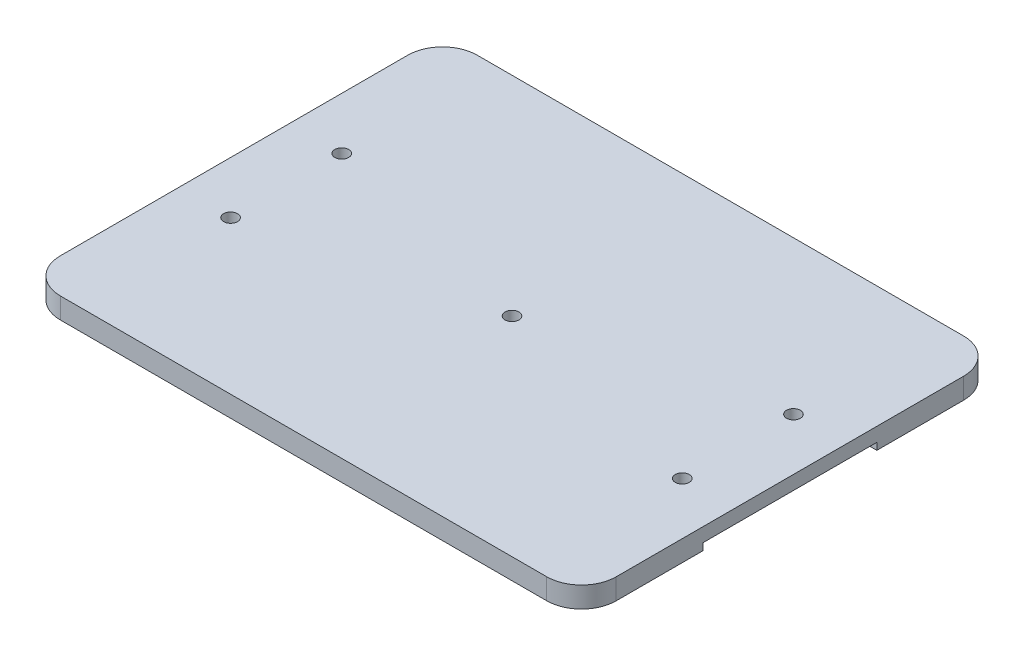
ISO-10303-21;
HEADER;
FILE_DESCRIPTION(('STEP AP214'),'2;1');
FILE_NAME('part.step','',(''),(''),'','','');
FILE_SCHEMA(('AUTOMOTIVE_DESIGN { 1 0 10303 214 1 1 1 1 }'));
ENDSEC;
DATA;
#1=APPLICATION_CONTEXT('core data for automotive mechanical design processes');
#2=APPLICATION_PROTOCOL_DEFINITION('international standard','automotive_design',2000,#1);
#3=PRODUCT_CONTEXT('',#1,'mechanical');
#4=PRODUCT('Part','Part','',(#3));
#5=PRODUCT_RELATED_PRODUCT_CATEGORY('part','',(#4));
#6=PRODUCT_DEFINITION_FORMATION('','',#4);
#7=PRODUCT_DEFINITION_CONTEXT('part definition',#1,'design');
#8=PRODUCT_DEFINITION('design','',#6,#7);
#9=PRODUCT_DEFINITION_SHAPE('','',#8);
#10=(LENGTH_UNIT() NAMED_UNIT(*) SI_UNIT(.MILLI.,.METRE.));
#11=(NAMED_UNIT(*) PLANE_ANGLE_UNIT() SI_UNIT($,.RADIAN.));
#12=(NAMED_UNIT(*) SI_UNIT($,.STERADIAN.) SOLID_ANGLE_UNIT());
#13=UNCERTAINTY_MEASURE_WITH_UNIT(LENGTH_MEASURE(1.E-05),#10,'distance_accuracy_value','');
#14=(GEOMETRIC_REPRESENTATION_CONTEXT(3) GLOBAL_UNCERTAINTY_ASSIGNED_CONTEXT((#13)) GLOBAL_UNIT_ASSIGNED_CONTEXT((#10,
#11,#12)) REPRESENTATION_CONTEXT('',''));
#15=CARTESIAN_POINT('',(0.,0.,0.));
#16=DIRECTION('',(0.,0.,1.));
#17=DIRECTION('',(1.,0.,0.));
#18=AXIS2_PLACEMENT_3D('',#15,#16,#17);
#19=CARTESIAN_POINT('',(20.75,3.,-25.5));
#20=DIRECTION('',(-1.,0.,0.));
#21=DIRECTION('',(0.,0.,1.));
#22=AXIS2_PLACEMENT_3D('',#19,#20,#21);
#23=PLANE('',#22);
#24=DIRECTION('',(0.,-1.,0.));
#25=VECTOR('',#24,1.);
#26=CARTESIAN_POINT('',(20.75,1.,-7.99999999999999));
#27=LINE('',#26,#25);
#28=CARTESIAN_POINT('',(20.75,1.,-7.99999999999999));
#29=VERTEX_POINT('',#28);
#30=CARTESIAN_POINT('',(20.75,0.,-7.99999999999999));
#31=VERTEX_POINT('',#30);
#32=EDGE_CURVE('E174',#29,#31,#27,.T.);
#33=ORIENTED_EDGE('',*,*,#32,.T.);
#34=DIRECTION('',(0.,0.,-1.));
#35=VECTOR('',#34,1.);
#36=CARTESIAN_POINT('',(20.75,0.,-25.5));
#37=LINE('',#36,#35);
#38=CARTESIAN_POINT('',(20.75,0.,-20.5));
#39=VERTEX_POINT('',#38);
#40=EDGE_CURVE('E300',#31,#39,#37,.T.);
#41=ORIENTED_EDGE('',*,*,#40,.T.);
#42=DIRECTION('',(0.,-1.,0.));
#43=VECTOR('',#42,1.);
#44=CARTESIAN_POINT('',(20.75,3.,-20.5));
#45=LINE('',#44,#43);
#46=CARTESIAN_POINT('',(20.75,3.,-20.5));
#47=VERTEX_POINT('',#46);
#48=EDGE_CURVE('E292',#39,#47,#45,.F.);
#49=ORIENTED_EDGE('',*,*,#48,.T.);
#50=DIRECTION('',(0.,0.,-1.));
#51=VECTOR('',#50,1.);
#52=CARTESIAN_POINT('',(20.75,3.,-25.5));
#53=LINE('',#52,#51);
#54=CARTESIAN_POINT('',(20.75,3.,29.5));
#55=VERTEX_POINT('',#54);
#56=EDGE_CURVE('E285',#55,#47,#53,.T.);
#57=ORIENTED_EDGE('',*,*,#56,.F.);
#58=DIRECTION('',(0.,-1.,0.));
#59=VECTOR('',#58,1.);
#60=CARTESIAN_POINT('',(20.75,3.,29.5));
#61=LINE('',#60,#59);
#62=CARTESIAN_POINT('',(20.75,0.,29.5));
#63=VERTEX_POINT('',#62);
#64=EDGE_CURVE('E308',#55,#63,#61,.T.);
#65=ORIENTED_EDGE('',*,*,#64,.T.);
#66=CARTESIAN_POINT('',(20.75,0.,17.));
#67=VERTEX_POINT('',#66);
#68=EDGE_CURVE('E301',#63,#67,#37,.T.);
#69=ORIENTED_EDGE('',*,*,#68,.T.);
#70=DIRECTION('',(0.,-1.,0.));
#71=VECTOR('',#70,1.);
#72=CARTESIAN_POINT('',(20.75,1.,17.));
#73=LINE('',#72,#71);
#74=CARTESIAN_POINT('',(20.75,1.,17.));
#75=VERTEX_POINT('',#74);
#76=EDGE_CURVE('E61',#75,#67,#73,.T.);
#77=ORIENTED_EDGE('',*,*,#76,.F.);
#78=DIRECTION('',(0.,0.,-1.));
#79=VECTOR('',#78,1.);
#80=CARTESIAN_POINT('',(20.75,1.,-7.99999999999999));
#81=LINE('',#80,#79);
#82=EDGE_CURVE('E167',#75,#29,#81,.T.);
#83=ORIENTED_EDGE('',*,*,#82,.T.);
#84=EDGE_LOOP('',(#33,#41,#49,#57,#65,#69,#77,#83));
#85=FACE_BOUND('',#84,.T.);
#86=ADVANCED_FACE('F43',(#85),#23,.F.);
#87=CARTESIAN_POINT('',(0.,0.,0.));
#88=DIRECTION('',(0.,1.,0.));
#89=DIRECTION('',(0.,0.,1.));
#90=AXIS2_PLACEMENT_3D('',#87,#88,#89);
#91=PLANE('',#90);
#92=CARTESIAN_POINT('',(-19.25,0.,4.5));
#93=DIRECTION('',(0.,-1.,0.));
#94=DIRECTION('',(0.,0.,-1.));
#95=AXIS2_PLACEMENT_3D('',#92,#93,#94);
#96=CIRCLE('',#95,1.);
#97=CARTESIAN_POINT('',(-19.25,0.,3.5));
#98=VERTEX_POINT('',#97);
#99=EDGE_CURVE('E181',#98,#98,#96,.T.);
#100=ORIENTED_EDGE('',*,*,#99,.F.);
#101=EDGE_LOOP('',(#100));
#102=FACE_BOUND('',#101,.T.);
#103=DIRECTION('',(-1.,0.,0.));
#104=VECTOR('',#103,1.);
#105=CARTESIAN_POINT('',(20.75,0.,-7.99999999999999));
#106=LINE('',#105,#104);
#107=CARTESIAN_POINT('',(5.75,0.,-7.99999999999999));
#108=VERTEX_POINT('',#107);
#109=EDGE_CURVE('E177',#31,#108,#106,.T.);
#110=ORIENTED_EDGE('',*,*,#109,.T.);
#111=DIRECTION('',(0.,0.,1.));
#112=VECTOR('',#111,1.);
#113=CARTESIAN_POINT('',(5.75,0.,-7.99999999999999));
#114=LINE('',#113,#112);
#115=CARTESIAN_POINT('',(5.75000000000001,0.,17.));
#116=VERTEX_POINT('',#115);
#117=EDGE_CURVE('E189',#108,#116,#114,.T.);
#118=ORIENTED_EDGE('',*,*,#117,.T.);
#119=DIRECTION('',(1.,0.,0.));
#120=VECTOR('',#119,1.);
#121=CARTESIAN_POINT('',(20.75,0.,17.));
#122=LINE('',#121,#120);
#123=EDGE_CURVE('E186',#116,#67,#122,.T.);
#124=ORIENTED_EDGE('',*,*,#123,.T.);
#125=ORIENTED_EDGE('',*,*,#68,.F.);
#126=CARTESIAN_POINT('',(15.75,0.,29.5));
#127=DIRECTION('',(0.,1.,0.));
#128=DIRECTION('',(0.,0.,1.));
#129=AXIS2_PLACEMENT_3D('',#126,#127,#128);
#130=CIRCLE('',#129,5.);
#131=CARTESIAN_POINT('',(15.75,0.,34.5));
#132=VERTEX_POINT('',#131);
#133=EDGE_CURVE('E322',#63,#132,#130,.F.);
#134=ORIENTED_EDGE('',*,*,#133,.T.);
#135=DIRECTION('',(1.,0.,0.));
#136=VECTOR('',#135,1.);
#137=CARTESIAN_POINT('',(-59.25,0.,34.5));
#138=LINE('',#137,#136);
#139=CARTESIAN_POINT('',(-54.25,0.,34.5));
#140=VERTEX_POINT('',#139);
#141=EDGE_CURVE('E296',#140,#132,#138,.T.);
#142=ORIENTED_EDGE('',*,*,#141,.F.);
#143=CARTESIAN_POINT('',(-54.25,0.,29.5));
#144=DIRECTION('',(0.,1.,0.));
#145=DIRECTION('',(0.,0.,1.));
#146=AXIS2_PLACEMENT_3D('',#143,#144,#145);
#147=CIRCLE('',#146,5.);
#148=CARTESIAN_POINT('',(-59.25,0.,29.5));
#149=VERTEX_POINT('',#148);
#150=EDGE_CURVE('E312',#140,#149,#147,.F.);
#151=ORIENTED_EDGE('',*,*,#150,.T.);
#152=DIRECTION('',(0.,0.,1.));
#153=VECTOR('',#152,1.);
#154=CARTESIAN_POINT('',(-59.25,0.,-25.5));
#155=LINE('',#154,#153);
#156=CARTESIAN_POINT('',(-59.25,0.,17.));
#157=VERTEX_POINT('',#156);
#158=EDGE_CURVE('E265',#157,#149,#155,.T.);
#159=ORIENTED_EDGE('',*,*,#158,.F.);
#160=DIRECTION('',(1.,0.,0.));
#161=VECTOR('',#160,1.);
#162=CARTESIAN_POINT('',(-59.25,0.,17.));
#163=LINE('',#162,#161);
#164=CARTESIAN_POINT('',(-44.25,0.,17.));
#165=VERTEX_POINT('',#164);
#166=EDGE_CURVE('E241',#157,#165,#163,.T.);
#167=ORIENTED_EDGE('',*,*,#166,.T.);
#168=DIRECTION('',(0.,0.,-1.));
#169=VECTOR('',#168,1.);
#170=CARTESIAN_POINT('',(-44.25,0.,17.));
#171=LINE('',#170,#169);
#172=CARTESIAN_POINT('',(-44.25,0.,-8.));
#173=VERTEX_POINT('',#172);
#174=EDGE_CURVE('E254',#165,#173,#171,.T.);
#175=ORIENTED_EDGE('',*,*,#174,.T.);
#176=DIRECTION('',(1.,0.,0.));
#177=VECTOR('',#176,1.);
#178=CARTESIAN_POINT('',(-59.25,0.,-8.));
#179=LINE('',#178,#177);
#180=CARTESIAN_POINT('',(-59.25,0.,-8.));
#181=VERTEX_POINT('',#180);
#182=EDGE_CURVE('E224',#181,#173,#179,.T.);
#183=ORIENTED_EDGE('',*,*,#182,.F.);
#184=CARTESIAN_POINT('',(-59.25,0.,-20.5));
#185=VERTEX_POINT('',#184);
#186=EDGE_CURVE('E293',#185,#181,#155,.T.);
#187=ORIENTED_EDGE('',*,*,#186,.F.);
#188=CARTESIAN_POINT('',(-54.25,0.,-20.5));
#189=DIRECTION('',(0.,1.,0.));
#190=DIRECTION('',(0.,0.,1.));
#191=AXIS2_PLACEMENT_3D('',#188,#189,#190);
#192=CIRCLE('',#191,5.);
#193=CARTESIAN_POINT('',(-54.25,0.,-25.5));
#194=VERTEX_POINT('',#193);
#195=EDGE_CURVE('E315',#185,#194,#192,.F.);
#196=ORIENTED_EDGE('',*,*,#195,.T.);
#197=DIRECTION('',(-1.,0.,0.));
#198=VECTOR('',#197,1.);
#199=CARTESIAN_POINT('',(-59.25,0.,-25.5));
#200=LINE('',#199,#198);
#201=CARTESIAN_POINT('',(15.75,0.,-25.5));
#202=VERTEX_POINT('',#201);
#203=EDGE_CURVE('E281',#202,#194,#200,.T.);
#204=ORIENTED_EDGE('',*,*,#203,.F.);
#205=CARTESIAN_POINT('',(15.75,0.,-20.5));
#206=DIRECTION('',(0.,1.,0.));
#207=DIRECTION('',(0.,0.,1.));
#208=AXIS2_PLACEMENT_3D('',#205,#206,#207);
#209=CIRCLE('',#208,5.);
#210=EDGE_CURVE('E318',#202,#39,#209,.F.);
#211=ORIENTED_EDGE('',*,*,#210,.T.);
#212=ORIENTED_EDGE('',*,*,#40,.F.);
#213=EDGE_LOOP('',(#110,#118,#124,#125,#134,#142,#151,#159,#167,#175,#183,#187,#196,#204,#211,#212));
#214=FACE_BOUND('',#213,.T.);
#215=ADVANCED_FACE('F382',(#102,#214),#91,.F.);
#216=CARTESIAN_POINT('',(-59.25,3.,-25.5));
#217=DIRECTION('',(1.,0.,0.));
#218=DIRECTION('',(0.,0.,-1.));
#219=AXIS2_PLACEMENT_3D('',#216,#217,#218);
#220=PLANE('',#219);
#221=DIRECTION('',(0.,0.,1.));
#222=VECTOR('',#221,1.);
#223=CARTESIAN_POINT('',(-59.25,3.,-25.5));
#224=LINE('',#223,#222);
#225=CARTESIAN_POINT('',(-59.25,3.,-20.5));
#226=VERTEX_POINT('',#225);
#227=CARTESIAN_POINT('',(-59.25,3.,29.5));
#228=VERTEX_POINT('',#227);
#229=EDGE_CURVE('E276',#226,#228,#224,.T.);
#230=ORIENTED_EDGE('',*,*,#229,.F.);
#231=DIRECTION('',(0.,-1.,0.));
#232=VECTOR('',#231,1.);
#233=CARTESIAN_POINT('',(-59.25,3.,-20.5));
#234=LINE('',#233,#232);
#235=EDGE_CURVE('E11',#226,#185,#234,.T.);
#236=ORIENTED_EDGE('',*,*,#235,.T.);
#237=ORIENTED_EDGE('',*,*,#186,.T.);
#238=DIRECTION('',(0.,-1.,0.));
#239=VECTOR('',#238,1.);
#240=CARTESIAN_POINT('',(-59.25,1.,-8.));
#241=LINE('',#240,#239);
#242=CARTESIAN_POINT('',(-59.25,1.,-8.));
#243=VERTEX_POINT('',#242);
#244=EDGE_CURVE('E261',#243,#181,#241,.T.);
#245=ORIENTED_EDGE('',*,*,#244,.F.);
#246=DIRECTION('',(0.,0.,-1.));
#247=VECTOR('',#246,1.);
#248=CARTESIAN_POINT('',(-59.25,1.,17.));
#249=LINE('',#248,#247);
#250=CARTESIAN_POINT('',(-59.25,1.,17.));
#251=VERTEX_POINT('',#250);
#252=EDGE_CURVE('E247',#251,#243,#249,.T.);
#253=ORIENTED_EDGE('',*,*,#252,.F.);
#254=DIRECTION('',(0.,-1.,0.));
#255=VECTOR('',#254,1.);
#256=CARTESIAN_POINT('',(-59.25,1.,17.));
#257=LINE('',#256,#255);
#258=EDGE_CURVE('E266',#251,#157,#257,.T.);
#259=ORIENTED_EDGE('',*,*,#258,.T.);
#260=ORIENTED_EDGE('',*,*,#158,.T.);
#261=DIRECTION('',(0.,-1.,0.));
#262=VECTOR('',#261,1.);
#263=CARTESIAN_POINT('',(-59.25,3.,29.5));
#264=LINE('',#263,#262);
#265=EDGE_CURVE('E53',#149,#228,#264,.F.);
#266=ORIENTED_EDGE('',*,*,#265,.T.);
#267=EDGE_LOOP('',(#230,#236,#237,#245,#253,#259,#260,#266));
#268=FACE_BOUND('',#267,.T.);
#269=ADVANCED_FACE('F387',(#268),#220,.F.);
#270=CARTESIAN_POINT('',(-59.25,3.,34.5));
#271=DIRECTION('',(0.,0.,-1.));
#272=DIRECTION('',(-1.,0.,0.));
#273=AXIS2_PLACEMENT_3D('',#270,#271,#272);
#274=PLANE('',#273);
#275=ORIENTED_EDGE('',*,*,#141,.T.);
#276=DIRECTION('',(0.,-1.,0.));
#277=VECTOR('',#276,1.);
#278=CARTESIAN_POINT('',(15.75,3.,34.5));
#279=LINE('',#278,#277);
#280=CARTESIAN_POINT('',(15.75,3.,34.5));
#281=VERTEX_POINT('',#280);
#282=EDGE_CURVE('E329',#132,#281,#279,.F.);
#283=ORIENTED_EDGE('',*,*,#282,.T.);
#284=DIRECTION('',(1.,0.,0.));
#285=VECTOR('',#284,1.);
#286=CARTESIAN_POINT('',(-59.25,3.,34.5));
#287=LINE('',#286,#285);
#288=CARTESIAN_POINT('',(-54.25,3.,34.5));
#289=VERTEX_POINT('',#288);
#290=EDGE_CURVE('E280',#289,#281,#287,.T.);
#291=ORIENTED_EDGE('',*,*,#290,.F.);
#292=DIRECTION('',(0.,-1.,0.));
#293=VECTOR('',#292,1.);
#294=CARTESIAN_POINT('',(-54.25,3.,34.5));
#295=LINE('',#294,#293);
#296=EDGE_CURVE('E325',#289,#140,#295,.T.);
#297=ORIENTED_EDGE('',*,*,#296,.T.);
#298=EDGE_LOOP('',(#275,#283,#291,#297));
#299=FACE_BOUND('',#298,.T.);
#300=ADVANCED_FACE('F393',(#299),#274,.F.);
#301=CARTESIAN_POINT('',(-59.25,3.,-25.5));
#302=DIRECTION('',(0.,0.,1.));
#303=DIRECTION('',(1.,0.,0.));
#304=AXIS2_PLACEMENT_3D('',#301,#302,#303);
#305=PLANE('',#304);
#306=DIRECTION('',(-1.,0.,0.));
#307=VECTOR('',#306,1.);
#308=CARTESIAN_POINT('',(-59.25,3.,-25.5));
#309=LINE('',#308,#307);
#310=CARTESIAN_POINT('',(15.75,3.,-25.5));
#311=VERTEX_POINT('',#310);
#312=CARTESIAN_POINT('',(-54.25,3.,-25.5));
#313=VERTEX_POINT('',#312);
#314=EDGE_CURVE('E289',#311,#313,#309,.T.);
#315=ORIENTED_EDGE('',*,*,#314,.F.);
#316=DIRECTION('',(0.,-1.,0.));
#317=VECTOR('',#316,1.);
#318=CARTESIAN_POINT('',(15.75,3.,-25.5));
#319=LINE('',#318,#317);
#320=EDGE_CURVE('E346',#311,#202,#319,.T.);
#321=ORIENTED_EDGE('',*,*,#320,.T.);
#322=ORIENTED_EDGE('',*,*,#203,.T.);
#323=DIRECTION('',(0.,-1.,0.));
#324=VECTOR('',#323,1.);
#325=CARTESIAN_POINT('',(-54.25,3.,-25.5));
#326=LINE('',#325,#324);
#327=EDGE_CURVE('E69',#194,#313,#326,.F.);
#328=ORIENTED_EDGE('',*,*,#327,.T.);
#329=EDGE_LOOP('',(#315,#321,#322,#328));
#330=FACE_BOUND('',#329,.T.);
#331=ADVANCED_FACE('F392',(#330),#305,.F.);
#332=CARTESIAN_POINT('',(0.,3.,0.));
#333=DIRECTION('',(0.,1.,0.));
#334=DIRECTION('',(0.,0.,1.));
#335=AXIS2_PLACEMENT_3D('',#332,#333,#334);
#336=PLANE('',#335);
#337=CARTESIAN_POINT('',(13.25,3.,-3.49999999999999));
#338=DIRECTION('',(0.,1.,0.));
#339=DIRECTION('',(0.,0.,1.));
#340=AXIS2_PLACEMENT_3D('',#337,#338,#339);
#341=CIRCLE('',#340,1.);
#342=CARTESIAN_POINT('',(13.25,3.,-2.49999999999999));
#343=VERTEX_POINT('',#342);
#344=EDGE_CURVE('E192',#343,#343,#341,.F.);
#345=ORIENTED_EDGE('',*,*,#344,.T.);
#346=EDGE_LOOP('',(#345));
#347=FACE_BOUND('',#346,.T.);
#348=CARTESIAN_POINT('',(13.25,3.,12.5));
#349=DIRECTION('',(0.,1.,0.));
#350=DIRECTION('',(0.,0.,1.));
#351=AXIS2_PLACEMENT_3D('',#348,#349,#350);
#352=CIRCLE('',#351,1.);
#353=CARTESIAN_POINT('',(13.25,3.,13.5));
#354=VERTEX_POINT('',#353);
#355=EDGE_CURVE('E354',#354,#354,#352,.F.);
#356=ORIENTED_EDGE('',*,*,#355,.T.);
#357=EDGE_LOOP('',(#356));
#358=FACE_BOUND('',#357,.T.);
#359=CARTESIAN_POINT('',(-19.25,3.,4.5));
#360=DIRECTION('',(0.,-1.,0.));
#361=DIRECTION('',(0.,0.,-1.));
#362=AXIS2_PLACEMENT_3D('',#359,#360,#361);
#363=CIRCLE('',#362,1.);
#364=CARTESIAN_POINT('',(-19.25,3.,3.5));
#365=VERTEX_POINT('',#364);
#366=EDGE_CURVE('E212',#365,#365,#363,.T.);
#367=ORIENTED_EDGE('',*,*,#366,.T.);
#368=EDGE_LOOP('',(#367));
#369=FACE_BOUND('',#368,.T.);
#370=CARTESIAN_POINT('',(-51.75,3.,12.5));
#371=DIRECTION('',(0.,-1.,0.));
#372=DIRECTION('',(0.,0.,-1.));
#373=AXIS2_PLACEMENT_3D('',#370,#371,#372);
#374=CIRCLE('',#373,0.999999999999998);
#375=CARTESIAN_POINT('',(-51.75,3.,11.5));
#376=VERTEX_POINT('',#375);
#377=EDGE_CURVE('E220',#376,#376,#374,.T.);
#378=ORIENTED_EDGE('',*,*,#377,.T.);
#379=EDGE_LOOP('',(#378));
#380=FACE_BOUND('',#379,.T.);
#381=CARTESIAN_POINT('',(-51.75,3.,-3.5));
#382=DIRECTION('',(0.,-1.,0.));
#383=DIRECTION('',(0.,0.,-1.));
#384=AXIS2_PLACEMENT_3D('',#381,#382,#383);
#385=CIRCLE('',#384,0.999999999999998);
#386=CARTESIAN_POINT('',(-51.75,3.,-4.5));
#387=VERTEX_POINT('',#386);
#388=EDGE_CURVE('E216',#387,#387,#385,.T.);
#389=ORIENTED_EDGE('',*,*,#388,.T.);
#390=EDGE_LOOP('',(#389));
#391=FACE_BOUND('',#390,.T.);
#392=ORIENTED_EDGE('',*,*,#290,.T.);
#393=CARTESIAN_POINT('',(15.75,3.,29.5));
#394=DIRECTION('',(0.,1.,0.));
#395=DIRECTION('',(0.,0.,1.));
#396=AXIS2_PLACEMENT_3D('',#393,#394,#395);
#397=CIRCLE('',#396,5.);
#398=EDGE_CURVE('E341',#281,#55,#397,.T.);
#399=ORIENTED_EDGE('',*,*,#398,.T.);
#400=ORIENTED_EDGE('',*,*,#56,.T.);
#401=CARTESIAN_POINT('',(15.75,3.,-20.5));
#402=DIRECTION('',(0.,1.,0.));
#403=DIRECTION('',(0.,0.,1.));
#404=AXIS2_PLACEMENT_3D('',#401,#402,#403);
#405=CIRCLE('',#404,5.);
#406=EDGE_CURVE('E338',#47,#311,#405,.T.);
#407=ORIENTED_EDGE('',*,*,#406,.T.);
#408=ORIENTED_EDGE('',*,*,#314,.T.);
#409=CARTESIAN_POINT('',(-54.25,3.,-20.5));
#410=DIRECTION('',(0.,1.,0.));
#411=DIRECTION('',(0.,0.,1.));
#412=AXIS2_PLACEMENT_3D('',#409,#410,#411);
#413=CIRCLE('',#412,5.);
#414=EDGE_CURVE('E335',#313,#226,#413,.T.);
#415=ORIENTED_EDGE('',*,*,#414,.T.);
#416=ORIENTED_EDGE('',*,*,#229,.T.);
#417=CARTESIAN_POINT('',(-54.25,3.,29.5));
#418=DIRECTION('',(0.,1.,0.));
#419=DIRECTION('',(0.,0.,1.));
#420=AXIS2_PLACEMENT_3D('',#417,#418,#419);
#421=CIRCLE('',#420,5.);
#422=EDGE_CURVE('E332',#228,#289,#421,.T.);
#423=ORIENTED_EDGE('',*,*,#422,.T.);
#424=EDGE_LOOP('',(#392,#399,#400,#407,#408,#415,#416,#423));
#425=FACE_BOUND('',#424,.T.);
#426=ADVANCED_FACE('F369',(#347,#358,#369,#380,#391,#425),#336,.T.);
#427=CARTESIAN_POINT('',(-59.25,1.,-8.));
#428=DIRECTION('',(0.,0.,-1.));
#429=DIRECTION('',(-1.,0.,0.));
#430=AXIS2_PLACEMENT_3D('',#427,#428,#429);
#431=PLANE('',#430);
#432=ORIENTED_EDGE('',*,*,#182,.T.);
#433=DIRECTION('',(0.,-1.,0.));
#434=VECTOR('',#433,1.);
#435=CARTESIAN_POINT('',(-44.25,1.,-8.));
#436=LINE('',#435,#434);
#437=CARTESIAN_POINT('',(-44.25,1.,-8.));
#438=VERTEX_POINT('',#437);
#439=EDGE_CURVE('E251',#438,#173,#436,.T.);
#440=ORIENTED_EDGE('',*,*,#439,.F.);
#441=DIRECTION('',(1.,0.,0.));
#442=VECTOR('',#441,1.);
#443=CARTESIAN_POINT('',(-59.25,1.,-8.));
#444=LINE('',#443,#442);
#445=EDGE_CURVE('E236',#243,#438,#444,.T.);
#446=ORIENTED_EDGE('',*,*,#445,.F.);
#447=ORIENTED_EDGE('',*,*,#244,.T.);
#448=EDGE_LOOP('',(#432,#440,#446,#447));
#449=FACE_BOUND('',#448,.T.);
#450=ADVANCED_FACE('F442',(#449),#431,.F.);
#451=CARTESIAN_POINT('',(-59.25,1.,17.));
#452=DIRECTION('',(0.,0.,-1.));
#453=DIRECTION('',(-1.,0.,0.));
#454=AXIS2_PLACEMENT_3D('',#451,#452,#453);
#455=PLANE('',#454);
#456=ORIENTED_EDGE('',*,*,#166,.F.);
#457=ORIENTED_EDGE('',*,*,#258,.F.);
#458=DIRECTION('',(1.,0.,0.));
#459=VECTOR('',#458,1.);
#460=CARTESIAN_POINT('',(-59.25,1.,17.));
#461=LINE('',#460,#459);
#462=CARTESIAN_POINT('',(-44.25,1.,17.));
#463=VERTEX_POINT('',#462);
#464=EDGE_CURVE('E244',#251,#463,#461,.T.);
#465=ORIENTED_EDGE('',*,*,#464,.T.);
#466=DIRECTION('',(0.,-1.,0.));
#467=VECTOR('',#466,1.);
#468=CARTESIAN_POINT('',(-44.25,1.,17.));
#469=LINE('',#468,#467);
#470=EDGE_CURVE('E270',#463,#165,#469,.T.);
#471=ORIENTED_EDGE('',*,*,#470,.T.);
#472=EDGE_LOOP('',(#456,#457,#465,#471));
#473=FACE_BOUND('',#472,.T.);
#474=ADVANCED_FACE('F480',(#473),#455,.T.);
#475=CARTESIAN_POINT('',(-44.25,1.,17.));
#476=DIRECTION('',(-1.,0.,0.));
#477=DIRECTION('',(0.,0.,1.));
#478=AXIS2_PLACEMENT_3D('',#475,#476,#477);
#479=PLANE('',#478);
#480=ORIENTED_EDGE('',*,*,#174,.F.);
#481=ORIENTED_EDGE('',*,*,#470,.F.);
#482=DIRECTION('',(0.,0.,-1.));
#483=VECTOR('',#482,1.);
#484=CARTESIAN_POINT('',(-44.25,1.,17.));
#485=LINE('',#484,#483);
#486=EDGE_CURVE('E240',#463,#438,#485,.T.);
#487=ORIENTED_EDGE('',*,*,#486,.T.);
#488=ORIENTED_EDGE('',*,*,#439,.T.);
#489=EDGE_LOOP('',(#480,#481,#487,#488));
#490=FACE_BOUND('',#489,.T.);
#491=ADVANCED_FACE('F478',(#490),#479,.T.);
#492=CARTESIAN_POINT('',(0.,1.,0.));
#493=DIRECTION('',(0.,1.,0.));
#494=DIRECTION('',(0.,0.,1.));
#495=AXIS2_PLACEMENT_3D('',#492,#493,#494);
#496=PLANE('',#495);
#497=CARTESIAN_POINT('',(-51.75,1.,12.5));
#498=DIRECTION('',(0.,-1.,0.));
#499=DIRECTION('',(0.,0.,-1.));
#500=AXIS2_PLACEMENT_3D('',#497,#498,#499);
#501=CIRCLE('',#500,0.999999999999998);
#502=CARTESIAN_POINT('',(-51.75,1.,11.5));
#503=VERTEX_POINT('',#502);
#504=EDGE_CURVE('E225',#503,#503,#501,.T.);
#505=ORIENTED_EDGE('',*,*,#504,.F.);
#506=EDGE_LOOP('',(#505));
#507=FACE_BOUND('',#506,.T.);
#508=CARTESIAN_POINT('',(-51.75,1.,-3.5));
#509=DIRECTION('',(0.,-1.,0.));
#510=DIRECTION('',(0.,0.,-1.));
#511=AXIS2_PLACEMENT_3D('',#508,#509,#510);
#512=CIRCLE('',#511,0.999999999999998);
#513=CARTESIAN_POINT('',(-51.75,1.,-4.5));
#514=VERTEX_POINT('',#513);
#515=EDGE_CURVE('E229',#514,#514,#512,.T.);
#516=ORIENTED_EDGE('',*,*,#515,.F.);
#517=EDGE_LOOP('',(#516));
#518=FACE_BOUND('',#517,.T.);
#519=ORIENTED_EDGE('',*,*,#445,.T.);
#520=ORIENTED_EDGE('',*,*,#486,.F.);
#521=ORIENTED_EDGE('',*,*,#464,.F.);
#522=ORIENTED_EDGE('',*,*,#252,.T.);
#523=EDGE_LOOP('',(#519,#520,#521,#522));
#524=FACE_BOUND('',#523,.T.);
#525=ADVANCED_FACE('F447',(#507,#518,#524),#496,.F.);
#526=CARTESIAN_POINT('',(-51.75,3.,-3.5));
#527=DIRECTION('',(0.,-1.,0.));
#528=DIRECTION('',(0.,0.,-1.));
#529=AXIS2_PLACEMENT_3D('',#526,#527,#528);
#530=CYLINDRICAL_SURFACE('',#529,0.999999999999998);
#531=ORIENTED_EDGE('',*,*,#388,.F.);
#532=EDGE_LOOP('',(#531));
#533=FACE_BOUND('',#532,.T.);
#534=ORIENTED_EDGE('',*,*,#515,.T.);
#535=EDGE_LOOP('',(#534));
#536=FACE_BOUND('',#535,.T.);
#537=ADVANCED_FACE('F471',(#533,#536),#530,.F.);
#538=CARTESIAN_POINT('',(-51.75,3.,12.5));
#539=DIRECTION('',(0.,-1.,0.));
#540=DIRECTION('',(0.,0.,-1.));
#541=AXIS2_PLACEMENT_3D('',#538,#539,#540);
#542=CYLINDRICAL_SURFACE('',#541,0.999999999999998);
#543=ORIENTED_EDGE('',*,*,#377,.F.);
#544=EDGE_LOOP('',(#543));
#545=FACE_BOUND('',#544,.T.);
#546=ORIENTED_EDGE('',*,*,#504,.T.);
#547=EDGE_LOOP('',(#546));
#548=FACE_BOUND('',#547,.T.);
#549=ADVANCED_FACE('F404',(#545,#548),#542,.F.);
#550=CARTESIAN_POINT('',(15.75,3.,29.5));
#551=DIRECTION('',(0.,-1.,0.));
#552=DIRECTION('',(0.,0.,-1.));
#553=AXIS2_PLACEMENT_3D('',#550,#551,#552);
#554=CYLINDRICAL_SURFACE('',#553,5.);
#555=ORIENTED_EDGE('',*,*,#398,.F.);
#556=ORIENTED_EDGE('',*,*,#282,.F.);
#557=ORIENTED_EDGE('',*,*,#133,.F.);
#558=ORIENTED_EDGE('',*,*,#64,.F.);
#559=EDGE_LOOP('',(#555,#556,#557,#558));
#560=FACE_BOUND('',#559,.T.);
#561=ADVANCED_FACE('F400',(#560),#554,.T.);
#562=CARTESIAN_POINT('',(15.75,3.,-20.5));
#563=DIRECTION('',(0.,-1.,0.));
#564=DIRECTION('',(0.,0.,-1.));
#565=AXIS2_PLACEMENT_3D('',#562,#563,#564);
#566=CYLINDRICAL_SURFACE('',#565,5.);
#567=ORIENTED_EDGE('',*,*,#406,.F.);
#568=ORIENTED_EDGE('',*,*,#48,.F.);
#569=ORIENTED_EDGE('',*,*,#210,.F.);
#570=ORIENTED_EDGE('',*,*,#320,.F.);
#571=EDGE_LOOP('',(#567,#568,#569,#570));
#572=FACE_BOUND('',#571,.T.);
#573=ADVANCED_FACE('F403',(#572),#566,.T.);
#574=CARTESIAN_POINT('',(-54.25,3.,-20.5));
#575=DIRECTION('',(0.,-1.,0.));
#576=DIRECTION('',(0.,0.,-1.));
#577=AXIS2_PLACEMENT_3D('',#574,#575,#576);
#578=CYLINDRICAL_SURFACE('',#577,5.);
#579=ORIENTED_EDGE('',*,*,#414,.F.);
#580=ORIENTED_EDGE('',*,*,#327,.F.);
#581=ORIENTED_EDGE('',*,*,#195,.F.);
#582=ORIENTED_EDGE('',*,*,#235,.F.);
#583=EDGE_LOOP('',(#579,#580,#581,#582));
#584=FACE_BOUND('',#583,.T.);
#585=ADVANCED_FACE('F407',(#584),#578,.T.);
#586=CARTESIAN_POINT('',(-54.25,3.,29.5));
#587=DIRECTION('',(0.,-1.,0.));
#588=DIRECTION('',(0.,0.,-1.));
#589=AXIS2_PLACEMENT_3D('',#586,#587,#588);
#590=CYLINDRICAL_SURFACE('',#589,5.);
#591=ORIENTED_EDGE('',*,*,#422,.F.);
#592=ORIENTED_EDGE('',*,*,#265,.F.);
#593=ORIENTED_EDGE('',*,*,#150,.F.);
#594=ORIENTED_EDGE('',*,*,#296,.F.);
#595=EDGE_LOOP('',(#591,#592,#593,#594));
#596=FACE_BOUND('',#595,.T.);
#597=ADVANCED_FACE('F45',(#596),#590,.T.);
#598=CARTESIAN_POINT('',(-19.25,3.,4.5));
#599=DIRECTION('',(0.,-1.,0.));
#600=DIRECTION('',(0.,0.,-1.));
#601=AXIS2_PLACEMENT_3D('',#598,#599,#600);
#602=CYLINDRICAL_SURFACE('',#601,1.);
#603=ORIENTED_EDGE('',*,*,#366,.F.);
#604=EDGE_LOOP('',(#603));
#605=FACE_BOUND('',#604,.T.);
#606=ORIENTED_EDGE('',*,*,#99,.T.);
#607=EDGE_LOOP('',(#606));
#608=FACE_BOUND('',#607,.T.);
#609=ADVANCED_FACE('F414',(#605,#608),#602,.F.);
#610=CARTESIAN_POINT('',(20.75,1.,-7.99999999999999));
#611=DIRECTION('',(0.,0.,1.));
#612=DIRECTION('',(1.,0.,0.));
#613=AXIS2_PLACEMENT_3D('',#610,#611,#612);
#614=PLANE('',#613);
#615=ORIENTED_EDGE('',*,*,#109,.F.);
#616=ORIENTED_EDGE('',*,*,#32,.F.);
#617=DIRECTION('',(-1.,0.,0.));
#618=VECTOR('',#617,1.);
#619=CARTESIAN_POINT('',(20.75,1.,-7.99999999999999));
#620=LINE('',#619,#618);
#621=CARTESIAN_POINT('',(5.75,1.,-7.99999999999999));
#622=VERTEX_POINT('',#621);
#623=EDGE_CURVE('E162',#29,#622,#620,.T.);
#624=ORIENTED_EDGE('',*,*,#623,.T.);
#625=DIRECTION('',(0.,-1.,0.));
#626=VECTOR('',#625,1.);
#627=CARTESIAN_POINT('',(5.75,1.,-7.99999999999999));
#628=LINE('',#627,#626);
#629=EDGE_CURVE('E182',#622,#108,#628,.T.);
#630=ORIENTED_EDGE('',*,*,#629,.T.);
#631=EDGE_LOOP('',(#615,#616,#624,#630));
#632=FACE_BOUND('',#631,.T.);
#633=ADVANCED_FACE('F175',(#632),#614,.T.);
#634=CARTESIAN_POINT('',(5.75,1.,-7.99999999999999));
#635=DIRECTION('',(1.,0.,0.));
#636=DIRECTION('',(0.,0.,-1.));
#637=AXIS2_PLACEMENT_3D('',#634,#635,#636);
#638=PLANE('',#637);
#639=ORIENTED_EDGE('',*,*,#117,.F.);
#640=ORIENTED_EDGE('',*,*,#629,.F.);
#641=DIRECTION('',(0.,0.,1.));
#642=VECTOR('',#641,1.);
#643=CARTESIAN_POINT('',(5.75,1.,-7.99999999999999));
#644=LINE('',#643,#642);
#645=CARTESIAN_POINT('',(5.75000000000001,1.,17.));
#646=VERTEX_POINT('',#645);
#647=EDGE_CURVE('E168',#622,#646,#644,.T.);
#648=ORIENTED_EDGE('',*,*,#647,.T.);
#649=DIRECTION('',(0.,-1.,0.));
#650=VECTOR('',#649,1.);
#651=CARTESIAN_POINT('',(5.75000000000001,1.,17.));
#652=LINE('',#651,#650);
#653=EDGE_CURVE('E207',#646,#116,#652,.T.);
#654=ORIENTED_EDGE('',*,*,#653,.T.);
#655=EDGE_LOOP('',(#639,#640,#648,#654));
#656=FACE_BOUND('',#655,.T.);
#657=ADVANCED_FACE('F455',(#656),#638,.T.);
#658=CARTESIAN_POINT('',(20.75,1.,17.));
#659=DIRECTION('',(0.,0.,-1.));
#660=DIRECTION('',(-1.,0.,0.));
#661=AXIS2_PLACEMENT_3D('',#658,#659,#660);
#662=PLANE('',#661);
#663=ORIENTED_EDGE('',*,*,#123,.F.);
#664=ORIENTED_EDGE('',*,*,#653,.F.);
#665=DIRECTION('',(1.,0.,0.));
#666=VECTOR('',#665,1.);
#667=CARTESIAN_POINT('',(20.75,1.,17.));
#668=LINE('',#667,#666);
#669=EDGE_CURVE('E197',#646,#75,#668,.T.);
#670=ORIENTED_EDGE('',*,*,#669,.T.);
#671=ORIENTED_EDGE('',*,*,#76,.T.);
#672=EDGE_LOOP('',(#663,#664,#670,#671));
#673=FACE_BOUND('',#672,.T.);
#674=ADVANCED_FACE('F453',(#673),#662,.T.);
#675=CARTESIAN_POINT('',(0.,1.,0.));
#676=DIRECTION('',(0.,-1.,0.));
#677=DIRECTION('',(0.,0.,-1.));
#678=AXIS2_PLACEMENT_3D('',#675,#676,#677);
#679=PLANE('',#678);
#680=CARTESIAN_POINT('',(13.25,1.,-3.49999999999999));
#681=DIRECTION('',(0.,-1.,0.));
#682=DIRECTION('',(0.,0.,-1.));
#683=AXIS2_PLACEMENT_3D('',#680,#681,#682);
#684=CIRCLE('',#683,1.);
#685=CARTESIAN_POINT('',(13.25,1.,-4.5));
#686=VERTEX_POINT('',#685);
#687=EDGE_CURVE('E47',#686,#686,#684,.F.);
#688=ORIENTED_EDGE('',*,*,#687,.T.);
#689=EDGE_LOOP('',(#688));
#690=FACE_BOUND('',#689,.T.);
#691=CARTESIAN_POINT('',(13.25,1.,12.5));
#692=DIRECTION('',(0.,-1.,0.));
#693=DIRECTION('',(0.,0.,-1.));
#694=AXIS2_PLACEMENT_3D('',#691,#692,#693);
#695=CIRCLE('',#694,1.);
#696=CARTESIAN_POINT('',(13.25,1.,11.5));
#697=VERTEX_POINT('',#696);
#698=EDGE_CURVE('E351',#697,#697,#695,.F.);
#699=ORIENTED_EDGE('',*,*,#698,.T.);
#700=EDGE_LOOP('',(#699));
#701=FACE_BOUND('',#700,.T.);
#702=ORIENTED_EDGE('',*,*,#82,.F.);
#703=ORIENTED_EDGE('',*,*,#669,.F.);
#704=ORIENTED_EDGE('',*,*,#647,.F.);
#705=ORIENTED_EDGE('',*,*,#623,.F.);
#706=EDGE_LOOP('',(#702,#703,#704,#705));
#707=FACE_BOUND('',#706,.T.);
#708=ADVANCED_FACE('F164',(#690,#701,#707),#679,.T.);
#709=CARTESIAN_POINT('',(13.25,7.,12.5));
#710=DIRECTION('',(0.,-1.,0.));
#711=DIRECTION('',(0.,0.,-1.));
#712=AXIS2_PLACEMENT_3D('',#709,#710,#711);
#713=CYLINDRICAL_SURFACE('',#712,1.);
#714=ORIENTED_EDGE('',*,*,#355,.F.);
#715=EDGE_LOOP('',(#714));
#716=FACE_BOUND('',#715,.T.);
#717=ORIENTED_EDGE('',*,*,#698,.F.);
#718=EDGE_LOOP('',(#717));
#719=FACE_BOUND('',#718,.T.);
#720=ADVANCED_FACE('F374',(#716,#719),#713,.F.);
#721=CARTESIAN_POINT('',(13.25,7.,-3.49999999999999));
#722=DIRECTION('',(0.,-1.,0.));
#723=DIRECTION('',(0.,0.,-1.));
#724=AXIS2_PLACEMENT_3D('',#721,#722,#723);
#725=CYLINDRICAL_SURFACE('',#724,1.);
#726=ORIENTED_EDGE('',*,*,#344,.F.);
#727=EDGE_LOOP('',(#726));
#728=FACE_BOUND('',#727,.T.);
#729=ORIENTED_EDGE('',*,*,#687,.F.);
#730=EDGE_LOOP('',(#729));
#731=FACE_BOUND('',#730,.T.);
#732=ADVANCED_FACE('F371',(#728,#731),#725,.F.);
#733=CLOSED_SHELL('',(#86,#215,#269,#300,#331,#426,#450,#474,#491,#525,#537,#549,#561,#573,#585,
#597,#609,#633,#657,#674,#708,#720,#732));
#734=MANIFOLD_SOLID_BREP('B2',#733);
#735=ADVANCED_BREP_SHAPE_REPRESENTATION('',(#18,#734),#14);
#736=SHAPE_DEFINITION_REPRESENTATION(#9,#735);
ENDSEC;
END-ISO-10303-21;
